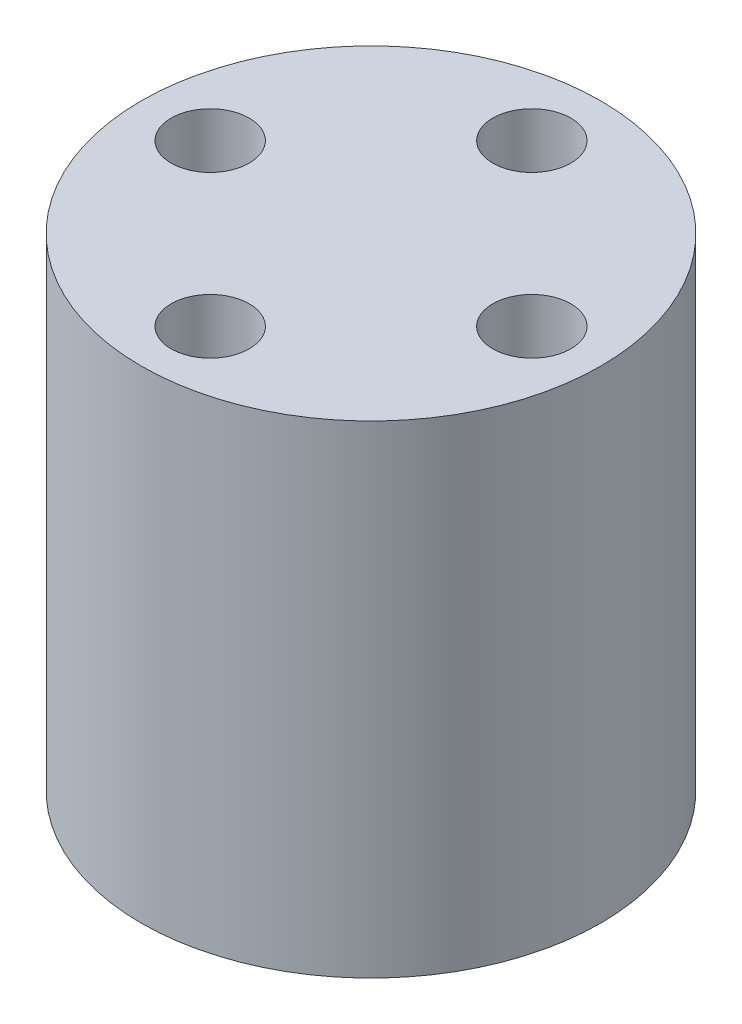
ISO-10303-21;
HEADER;
FILE_DESCRIPTION(('STEP AP214'),'2;1');
FILE_NAME('part.step','',(''),(''),'','','');
FILE_SCHEMA(('AUTOMOTIVE_DESIGN { 1 0 10303 214 1 1 1 1 }'));
ENDSEC;
DATA;
#1=APPLICATION_CONTEXT('core data for automotive mechanical design processes');
#2=APPLICATION_PROTOCOL_DEFINITION('international standard','automotive_design',2000,#1);
#3=PRODUCT_CONTEXT('',#1,'mechanical');
#4=PRODUCT('Part','Part','',(#3));
#5=PRODUCT_RELATED_PRODUCT_CATEGORY('part','',(#4));
#6=PRODUCT_DEFINITION_FORMATION('','',#4);
#7=PRODUCT_DEFINITION_CONTEXT('part definition',#1,'design');
#8=PRODUCT_DEFINITION('design','',#6,#7);
#9=PRODUCT_DEFINITION_SHAPE('','',#8);
#10=(LENGTH_UNIT() NAMED_UNIT(*) SI_UNIT(.MILLI.,.METRE.));
#11=(NAMED_UNIT(*) PLANE_ANGLE_UNIT() SI_UNIT($,.RADIAN.));
#12=(NAMED_UNIT(*) SI_UNIT($,.STERADIAN.) SOLID_ANGLE_UNIT());
#13=UNCERTAINTY_MEASURE_WITH_UNIT(LENGTH_MEASURE(1.E-05),#10,'distance_accuracy_value','');
#14=(GEOMETRIC_REPRESENTATION_CONTEXT(3) GLOBAL_UNCERTAINTY_ASSIGNED_CONTEXT((#13)) GLOBAL_UNIT_ASSIGNED_CONTEXT((#10,
#11,#12)) REPRESENTATION_CONTEXT('',''));
#15=CARTESIAN_POINT('',(0.,0.,0.));
#16=DIRECTION('',(0.,0.,1.));
#17=DIRECTION('',(1.,0.,0.));
#18=AXIS2_PLACEMENT_3D('',#15,#16,#17);
#19=CARTESIAN_POINT('',(0.,21.,0.));
#20=DIRECTION('',(0.,1.,0.));
#21=DIRECTION('',(0.,0.,1.));
#22=AXIS2_PLACEMENT_3D('',#19,#20,#21);
#23=PLANE('',#22);
#24=CARTESIAN_POINT('',(0.,21.,7.));
#25=DIRECTION('',(0.,1.,0.));
#26=DIRECTION('',(0.,0.,1.));
#27=AXIS2_PLACEMENT_3D('',#24,#25,#26);
#28=CIRCLE('',#27,1.7);
#29=CARTESIAN_POINT('',(0.,21.,5.3));
#30=VERTEX_POINT('',#29);
#31=EDGE_CURVE('E70',#30,#30,#28,.T.);
#32=ORIENTED_EDGE('',*,*,#31,.F.);
#33=EDGE_LOOP('',(#32));
#34=FACE_BOUND('',#33,.T.);
#35=CARTESIAN_POINT('',(0.,21.,-7.));
#36=DIRECTION('',(0.,1.,0.));
#37=DIRECTION('',(0.,0.,1.));
#38=AXIS2_PLACEMENT_3D('',#35,#36,#37);
#39=CIRCLE('',#38,1.7);
#40=CARTESIAN_POINT('',(0.,21.,-8.7));
#41=VERTEX_POINT('',#40);
#42=EDGE_CURVE('E56',#41,#41,#39,.T.);
#43=ORIENTED_EDGE('',*,*,#42,.F.);
#44=EDGE_LOOP('',(#43));
#45=FACE_BOUND('',#44,.T.);
#46=CARTESIAN_POINT('',(0.,21.,0.));
#47=DIRECTION('',(0.,1.,0.));
#48=DIRECTION('',(0.,0.,1.));
#49=AXIS2_PLACEMENT_3D('',#46,#47,#48);
#50=CIRCLE('',#49,10.);
#51=CARTESIAN_POINT('',(0.,21.,-10.));
#52=VERTEX_POINT('',#51);
#53=EDGE_CURVE('E10',#52,#52,#50,.T.);
#54=ORIENTED_EDGE('',*,*,#53,.T.);
#55=EDGE_LOOP('',(#54));
#56=FACE_BOUND('',#55,.T.);
#57=CARTESIAN_POINT('',(7.,21.,0.));
#58=DIRECTION('',(0.,1.,0.));
#59=DIRECTION('',(0.,0.,1.));
#60=AXIS2_PLACEMENT_3D('',#57,#58,#59);
#61=CIRCLE('',#60,1.7);
#62=CARTESIAN_POINT('',(7.,21.,-1.69999999999997));
#63=VERTEX_POINT('',#62);
#64=EDGE_CURVE('E62',#63,#63,#61,.T.);
#65=ORIENTED_EDGE('',*,*,#64,.F.);
#66=EDGE_LOOP('',(#65));
#67=FACE_BOUND('',#66,.T.);
#68=CARTESIAN_POINT('',(-7.,21.,0.));
#69=DIRECTION('',(0.,1.,0.));
#70=DIRECTION('',(0.,0.,1.));
#71=AXIS2_PLACEMENT_3D('',#68,#69,#70);
#72=CIRCLE('',#71,1.7);
#73=CARTESIAN_POINT('',(-7.,21.,-1.70000000000007));
#74=VERTEX_POINT('',#73);
#75=EDGE_CURVE('E78',#74,#74,#72,.T.);
#76=ORIENTED_EDGE('',*,*,#75,.F.);
#77=EDGE_LOOP('',(#76));
#78=FACE_BOUND('',#77,.T.);
#79=ADVANCED_FACE('F43',(#34,#45,#56,#67,#78),#23,.T.);
#80=CARTESIAN_POINT('',(0.,0.,0.));
#81=DIRECTION('',(0.,1.,0.));
#82=DIRECTION('',(0.,0.,1.));
#83=AXIS2_PLACEMENT_3D('',#80,#81,#82);
#84=PLANE('',#83);
#85=CARTESIAN_POINT('',(0.,0.,0.));
#86=DIRECTION('',(0.,1.,0.));
#87=DIRECTION('',(0.,0.,1.));
#88=AXIS2_PLACEMENT_3D('',#85,#86,#87);
#89=CIRCLE('',#88,10.);
#90=CARTESIAN_POINT('',(0.,0.,-10.));
#91=VERTEX_POINT('',#90);
#92=EDGE_CURVE('E47',#91,#91,#89,.T.);
#93=ORIENTED_EDGE('',*,*,#92,.F.);
#94=EDGE_LOOP('',(#93));
#95=FACE_BOUND('',#94,.T.);
#96=CARTESIAN_POINT('',(0.,0.,-7.));
#97=DIRECTION('',(0.,1.,0.));
#98=DIRECTION('',(0.,0.,1.));
#99=AXIS2_PLACEMENT_3D('',#96,#97,#98);
#100=CIRCLE('',#99,1.7);
#101=CARTESIAN_POINT('',(0.,0.,-8.7));
#102=VERTEX_POINT('',#101);
#103=EDGE_CURVE('E58',#102,#102,#100,.T.);
#104=ORIENTED_EDGE('',*,*,#103,.T.);
#105=EDGE_LOOP('',(#104));
#106=FACE_BOUND('',#105,.T.);
#107=CARTESIAN_POINT('',(7.,0.,0.));
#108=DIRECTION('',(0.,1.,0.));
#109=DIRECTION('',(0.,0.,1.));
#110=AXIS2_PLACEMENT_3D('',#107,#108,#109);
#111=CIRCLE('',#110,1.7);
#112=CARTESIAN_POINT('',(7.,0.,-1.69999999999997));
#113=VERTEX_POINT('',#112);
#114=EDGE_CURVE('E66',#113,#113,#111,.T.);
#115=ORIENTED_EDGE('',*,*,#114,.T.);
#116=EDGE_LOOP('',(#115));
#117=FACE_BOUND('',#116,.T.);
#118=CARTESIAN_POINT('',(0.,0.,7.));
#119=DIRECTION('',(0.,1.,0.));
#120=DIRECTION('',(0.,0.,1.));
#121=AXIS2_PLACEMENT_3D('',#118,#119,#120);
#122=CIRCLE('',#121,1.7);
#123=CARTESIAN_POINT('',(0.,0.,5.3));
#124=VERTEX_POINT('',#123);
#125=EDGE_CURVE('E74',#124,#124,#122,.T.);
#126=ORIENTED_EDGE('',*,*,#125,.T.);
#127=EDGE_LOOP('',(#126));
#128=FACE_BOUND('',#127,.T.);
#129=CARTESIAN_POINT('',(-7.,0.,0.));
#130=DIRECTION('',(0.,1.,0.));
#131=DIRECTION('',(0.,0.,1.));
#132=AXIS2_PLACEMENT_3D('',#129,#130,#131);
#133=CIRCLE('',#132,1.7);
#134=CARTESIAN_POINT('',(-7.,0.,-1.70000000000007));
#135=VERTEX_POINT('',#134);
#136=EDGE_CURVE('E82',#135,#135,#133,.T.);
#137=ORIENTED_EDGE('',*,*,#136,.T.);
#138=EDGE_LOOP('',(#137));
#139=FACE_BOUND('',#138,.T.);
#140=ADVANCED_FACE('F94',(#95,#106,#117,#128,#139),#84,.F.);
#141=CARTESIAN_POINT('',(0.,21.,0.));
#142=DIRECTION('',(0.,-1.,0.));
#143=DIRECTION('',(0.,0.,-1.));
#144=AXIS2_PLACEMENT_3D('',#141,#142,#143);
#145=CYLINDRICAL_SURFACE('',#144,10.);
#146=CARTESIAN_POINT('',(0.,21.,-10.));
#147=CARTESIAN_POINT('',(0.,20.78125,-10.));
#148=CARTESIAN_POINT('',(0.,20.5625,-10.));
#149=CARTESIAN_POINT('',(0.,20.125,-10.));
#150=CARTESIAN_POINT('',(0.,19.90625,-10.));
#151=CARTESIAN_POINT('',(0.,19.46875,-10.));
#152=CARTESIAN_POINT('',(0.,19.25,-10.));
#153=CARTESIAN_POINT('',(0.,18.8125,-10.));
#154=CARTESIAN_POINT('',(0.,18.59375,-10.));
#155=CARTESIAN_POINT('',(0.,18.15625,-10.));
#156=CARTESIAN_POINT('',(0.,17.9375,-10.));
#157=CARTESIAN_POINT('',(0.,17.5,-10.));
#158=CARTESIAN_POINT('',(0.,17.28125,-10.));
#159=CARTESIAN_POINT('',(0.,16.84375,-10.));
#160=CARTESIAN_POINT('',(0.,16.625,-10.));
#161=CARTESIAN_POINT('',(0.,16.1875,-10.));
#162=CARTESIAN_POINT('',(0.,15.96875,-10.));
#163=CARTESIAN_POINT('',(0.,15.53125,-10.));
#164=CARTESIAN_POINT('',(0.,15.3125,-10.));
#165=CARTESIAN_POINT('',(0.,14.875,-10.));
#166=CARTESIAN_POINT('',(0.,14.65625,-10.));
#167=CARTESIAN_POINT('',(0.,14.21875,-10.));
#168=CARTESIAN_POINT('',(0.,14.,-10.));
#169=CARTESIAN_POINT('',(0.,13.5625,-10.));
#170=CARTESIAN_POINT('',(0.,13.34375,-10.));
#171=CARTESIAN_POINT('',(0.,12.90625,-10.));
#172=CARTESIAN_POINT('',(0.,12.6875,-10.));
#173=CARTESIAN_POINT('',(0.,12.25,-10.));
#174=CARTESIAN_POINT('',(0.,12.03125,-10.));
#175=CARTESIAN_POINT('',(0.,11.59375,-10.));
#176=CARTESIAN_POINT('',(0.,11.375,-10.));
#177=CARTESIAN_POINT('',(0.,10.9375,-10.));
#178=CARTESIAN_POINT('',(0.,10.71875,-10.));
#179=CARTESIAN_POINT('',(0.,10.28125,-10.));
#180=CARTESIAN_POINT('',(0.,10.0625,-10.));
#181=CARTESIAN_POINT('',(0.,9.625,-10.));
#182=CARTESIAN_POINT('',(0.,9.40625,-10.));
#183=CARTESIAN_POINT('',(0.,8.96875,-10.));
#184=CARTESIAN_POINT('',(0.,8.75,-10.));
#185=CARTESIAN_POINT('',(0.,8.3125,-10.));
#186=CARTESIAN_POINT('',(0.,8.09375,-10.));
#187=CARTESIAN_POINT('',(0.,7.65625,-10.));
#188=CARTESIAN_POINT('',(0.,7.4375,-10.));
#189=CARTESIAN_POINT('',(0.,7.,-10.));
#190=CARTESIAN_POINT('',(0.,6.78125,-10.));
#191=CARTESIAN_POINT('',(0.,6.34375,-10.));
#192=CARTESIAN_POINT('',(0.,6.125,-10.));
#193=CARTESIAN_POINT('',(0.,5.6875,-10.));
#194=CARTESIAN_POINT('',(0.,5.46875,-10.));
#195=CARTESIAN_POINT('',(0.,5.03125,-10.));
#196=CARTESIAN_POINT('',(0.,4.8125,-10.));
#197=CARTESIAN_POINT('',(0.,4.375,-10.));
#198=CARTESIAN_POINT('',(0.,4.15625,-10.));
#199=CARTESIAN_POINT('',(0.,3.71875,-10.));
#200=CARTESIAN_POINT('',(0.,3.5,-10.));
#201=CARTESIAN_POINT('',(0.,3.0625,-10.));
#202=CARTESIAN_POINT('',(0.,2.84375,-10.));
#203=CARTESIAN_POINT('',(0.,2.40625,-10.));
#204=CARTESIAN_POINT('',(0.,2.1875,-10.));
#205=CARTESIAN_POINT('',(0.,1.75,-10.));
#206=CARTESIAN_POINT('',(0.,1.53125,-10.));
#207=CARTESIAN_POINT('',(0.,1.09375,-10.));
#208=CARTESIAN_POINT('',(0.,0.875000000000001,-10.));
#209=CARTESIAN_POINT('',(0.,0.4375,-10.));
#210=CARTESIAN_POINT('',(0.,0.21875,-10.));
#211=CARTESIAN_POINT('',(0.,0.,-10.));
#212=B_SPLINE_CURVE_WITH_KNOTS('',3,(#146,#147,#148,#149,#150,#151,#152,#153,#154,#155,#156,
#157,#158,#159,#160,#161,#162,#163,#164,#165,#166,#167,#168,#169,#170,#171,#172,#173,#174,#175,
#176,#177,#178,#179,#180,#181,#182,#183,#184,#185,#186,#187,#188,#189,#190,#191,#192,#193,#194,
#195,#196,#197,#198,#199,#200,#201,#202,#203,#204,#205,#206,#207,#208,#209,#210,#211),
.UNSPECIFIED.,.F.,.F.,(4,2,2,2,2,2,2,2,2,2,2,2,2,2,2,2,2,2,2,2,2,2,2,2,2,2,2,2,2,2,2,2,4),(0.,
0.656249999999997,1.3125,1.96875,2.625,3.28125,3.9375,4.59375,5.25,5.90625,6.5625,7.21875,7.875,
8.53125,9.1875,9.84375,10.5,11.15625,11.8125,12.46875,13.125,13.78125,14.4375,15.09375,15.75,
16.40625,17.0625,17.71875,18.375,19.03125,19.6875,20.34375,21.),.UNSPECIFIED.);
#213=EDGE_CURVE('BSEAM45',#52,#91,#212,.T.);
#214=ORIENTED_EDGE('',*,*,#53,.F.);
#215=ORIENTED_EDGE('',*,*,#92,.T.);
#216=ORIENTED_EDGE('',*,*,#213,.T.);
#217=ORIENTED_EDGE('',*,*,#213,.F.);
#218=EDGE_LOOP('',(#214,#216,#215,#217));
#219=FACE_BOUND('',#218,.T.);
#220=ADVANCED_FACE('F45',(#219),#145,.T.);
#221=CARTESIAN_POINT('',(0.,21.,-7.));
#222=DIRECTION('',(0.,-1.,0.));
#223=DIRECTION('',(0.,0.,-1.));
#224=AXIS2_PLACEMENT_3D('',#221,#222,#223);
#225=CYLINDRICAL_SURFACE('',#224,1.7);
#226=CARTESIAN_POINT('',(0.,21.,-8.7));
#227=CARTESIAN_POINT('',(0.,20.78125,-8.7));
#228=CARTESIAN_POINT('',(0.,20.5625,-8.7));
#229=CARTESIAN_POINT('',(0.,20.125,-8.7));
#230=CARTESIAN_POINT('',(0.,19.90625,-8.7));
#231=CARTESIAN_POINT('',(0.,19.46875,-8.7));
#232=CARTESIAN_POINT('',(0.,19.25,-8.7));
#233=CARTESIAN_POINT('',(0.,18.8125,-8.7));
#234=CARTESIAN_POINT('',(0.,18.59375,-8.7));
#235=CARTESIAN_POINT('',(0.,18.15625,-8.7));
#236=CARTESIAN_POINT('',(0.,17.9375,-8.7));
#237=CARTESIAN_POINT('',(0.,17.5,-8.7));
#238=CARTESIAN_POINT('',(0.,17.28125,-8.7));
#239=CARTESIAN_POINT('',(0.,16.84375,-8.7));
#240=CARTESIAN_POINT('',(0.,16.625,-8.7));
#241=CARTESIAN_POINT('',(0.,16.1875,-8.7));
#242=CARTESIAN_POINT('',(0.,15.96875,-8.7));
#243=CARTESIAN_POINT('',(0.,15.53125,-8.7));
#244=CARTESIAN_POINT('',(0.,15.3125,-8.7));
#245=CARTESIAN_POINT('',(0.,14.875,-8.7));
#246=CARTESIAN_POINT('',(0.,14.65625,-8.7));
#247=CARTESIAN_POINT('',(0.,14.21875,-8.7));
#248=CARTESIAN_POINT('',(0.,14.,-8.7));
#249=CARTESIAN_POINT('',(0.,13.5625,-8.7));
#250=CARTESIAN_POINT('',(0.,13.34375,-8.7));
#251=CARTESIAN_POINT('',(0.,12.90625,-8.7));
#252=CARTESIAN_POINT('',(0.,12.6875,-8.7));
#253=CARTESIAN_POINT('',(0.,12.25,-8.7));
#254=CARTESIAN_POINT('',(0.,12.03125,-8.7));
#255=CARTESIAN_POINT('',(0.,11.59375,-8.7));
#256=CARTESIAN_POINT('',(0.,11.375,-8.7));
#257=CARTESIAN_POINT('',(0.,10.9375,-8.7));
#258=CARTESIAN_POINT('',(0.,10.71875,-8.7));
#259=CARTESIAN_POINT('',(0.,10.28125,-8.7));
#260=CARTESIAN_POINT('',(0.,10.0625,-8.7));
#261=CARTESIAN_POINT('',(0.,9.625,-8.7));
#262=CARTESIAN_POINT('',(0.,9.40625,-8.7));
#263=CARTESIAN_POINT('',(0.,8.96875,-8.7));
#264=CARTESIAN_POINT('',(0.,8.75,-8.7));
#265=CARTESIAN_POINT('',(0.,8.3125,-8.7));
#266=CARTESIAN_POINT('',(0.,8.09375,-8.7));
#267=CARTESIAN_POINT('',(0.,7.65625,-8.7));
#268=CARTESIAN_POINT('',(0.,7.4375,-8.7));
#269=CARTESIAN_POINT('',(0.,7.,-8.7));
#270=CARTESIAN_POINT('',(0.,6.78125,-8.7));
#271=CARTESIAN_POINT('',(0.,6.34375,-8.7));
#272=CARTESIAN_POINT('',(0.,6.125,-8.7));
#273=CARTESIAN_POINT('',(0.,5.6875,-8.7));
#274=CARTESIAN_POINT('',(0.,5.46875,-8.7));
#275=CARTESIAN_POINT('',(0.,5.03125,-8.7));
#276=CARTESIAN_POINT('',(0.,4.8125,-8.7));
#277=CARTESIAN_POINT('',(0.,4.375,-8.7));
#278=CARTESIAN_POINT('',(0.,4.15625,-8.7));
#279=CARTESIAN_POINT('',(0.,3.71875,-8.7));
#280=CARTESIAN_POINT('',(0.,3.5,-8.7));
#281=CARTESIAN_POINT('',(0.,3.0625,-8.7));
#282=CARTESIAN_POINT('',(0.,2.84375,-8.7));
#283=CARTESIAN_POINT('',(0.,2.40625,-8.7));
#284=CARTESIAN_POINT('',(0.,2.1875,-8.7));
#285=CARTESIAN_POINT('',(0.,1.75,-8.7));
#286=CARTESIAN_POINT('',(0.,1.53125,-8.7));
#287=CARTESIAN_POINT('',(0.,1.09375,-8.7));
#288=CARTESIAN_POINT('',(0.,0.875000000000001,-8.7));
#289=CARTESIAN_POINT('',(0.,0.4375,-8.7));
#290=CARTESIAN_POINT('',(0.,0.21875,-8.7));
#291=CARTESIAN_POINT('',(0.,0.,-8.7));
#292=B_SPLINE_CURVE_WITH_KNOTS('',3,(#226,#227,#228,#229,#230,#231,#232,#233,#234,#235,#236,
#237,#238,#239,#240,#241,#242,#243,#244,#245,#246,#247,#248,#249,#250,#251,#252,#253,#254,#255,
#256,#257,#258,#259,#260,#261,#262,#263,#264,#265,#266,#267,#268,#269,#270,#271,#272,#273,#274,
#275,#276,#277,#278,#279,#280,#281,#282,#283,#284,#285,#286,#287,#288,#289,#290,#291),
.UNSPECIFIED.,.F.,.F.,(4,2,2,2,2,2,2,2,2,2,2,2,2,2,2,2,2,2,2,2,2,2,2,2,2,2,2,2,2,2,2,2,4),(0.,
0.656249999999997,1.3125,1.96875,2.625,3.28125,3.9375,4.59375,5.25,5.90625,6.5625,7.21875,7.875,
8.53125,9.1875,9.84375,10.5,11.15625,11.8125,12.46875,13.125,13.78125,14.4375,15.09375,15.75,
16.40625,17.0625,17.71875,18.375,19.03125,19.6875,20.34375,21.),.UNSPECIFIED.);
#293=EDGE_CURVE('BSEAM104',#41,#102,#292,.T.);
#294=ORIENTED_EDGE('',*,*,#42,.T.);
#295=ORIENTED_EDGE('',*,*,#103,.F.);
#296=ORIENTED_EDGE('',*,*,#293,.T.);
#297=ORIENTED_EDGE('',*,*,#293,.F.);
#298=EDGE_LOOP('',(#294,#296,#295,#297));
#299=FACE_BOUND('',#298,.T.);
#300=ADVANCED_FACE('F104',(#299),#225,.F.);
#301=CARTESIAN_POINT('',(7.,21.,0.));
#302=DIRECTION('',(0.,-1.,0.));
#303=DIRECTION('',(0.,0.,-1.));
#304=AXIS2_PLACEMENT_3D('',#301,#302,#303);
#305=CYLINDRICAL_SURFACE('',#304,1.7);
#306=CARTESIAN_POINT('',(7.,21.,-1.69999999999997));
#307=CARTESIAN_POINT('',(7.,20.78125,-1.69999999999997));
#308=CARTESIAN_POINT('',(7.,20.5625,-1.69999999999997));
#309=CARTESIAN_POINT('',(7.,20.125,-1.69999999999997));
#310=CARTESIAN_POINT('',(7.,19.90625,-1.69999999999997));
#311=CARTESIAN_POINT('',(7.,19.46875,-1.69999999999997));
#312=CARTESIAN_POINT('',(7.,19.25,-1.69999999999997));
#313=CARTESIAN_POINT('',(7.,18.8125,-1.69999999999997));
#314=CARTESIAN_POINT('',(7.,18.59375,-1.69999999999997));
#315=CARTESIAN_POINT('',(7.,18.15625,-1.69999999999997));
#316=CARTESIAN_POINT('',(7.,17.9375,-1.69999999999997));
#317=CARTESIAN_POINT('',(7.,17.5,-1.69999999999997));
#318=CARTESIAN_POINT('',(7.,17.28125,-1.69999999999997));
#319=CARTESIAN_POINT('',(7.,16.84375,-1.69999999999997));
#320=CARTESIAN_POINT('',(7.,16.625,-1.69999999999997));
#321=CARTESIAN_POINT('',(7.,16.1875,-1.69999999999997));
#322=CARTESIAN_POINT('',(7.,15.96875,-1.69999999999997));
#323=CARTESIAN_POINT('',(7.,15.53125,-1.69999999999997));
#324=CARTESIAN_POINT('',(7.,15.3125,-1.69999999999997));
#325=CARTESIAN_POINT('',(7.,14.875,-1.69999999999997));
#326=CARTESIAN_POINT('',(7.,14.65625,-1.69999999999997));
#327=CARTESIAN_POINT('',(7.,14.21875,-1.69999999999997));
#328=CARTESIAN_POINT('',(7.,14.,-1.69999999999997));
#329=CARTESIAN_POINT('',(7.,13.5625,-1.69999999999997));
#330=CARTESIAN_POINT('',(7.,13.34375,-1.69999999999997));
#331=CARTESIAN_POINT('',(7.,12.90625,-1.69999999999997));
#332=CARTESIAN_POINT('',(7.,12.6875,-1.69999999999997));
#333=CARTESIAN_POINT('',(7.,12.25,-1.69999999999997));
#334=CARTESIAN_POINT('',(7.,12.03125,-1.69999999999997));
#335=CARTESIAN_POINT('',(7.,11.59375,-1.69999999999997));
#336=CARTESIAN_POINT('',(7.,11.375,-1.69999999999997));
#337=CARTESIAN_POINT('',(7.,10.9375,-1.69999999999997));
#338=CARTESIAN_POINT('',(7.,10.71875,-1.69999999999997));
#339=CARTESIAN_POINT('',(7.,10.28125,-1.69999999999997));
#340=CARTESIAN_POINT('',(7.,10.0625,-1.69999999999997));
#341=CARTESIAN_POINT('',(7.,9.625,-1.69999999999997));
#342=CARTESIAN_POINT('',(7.,9.40625,-1.69999999999997));
#343=CARTESIAN_POINT('',(7.,8.96875,-1.69999999999997));
#344=CARTESIAN_POINT('',(7.,8.75,-1.69999999999997));
#345=CARTESIAN_POINT('',(7.,8.3125,-1.69999999999997));
#346=CARTESIAN_POINT('',(7.,8.09375,-1.69999999999997));
#347=CARTESIAN_POINT('',(7.,7.65625,-1.69999999999997));
#348=CARTESIAN_POINT('',(7.,7.4375,-1.69999999999997));
#349=CARTESIAN_POINT('',(7.,7.,-1.69999999999997));
#350=CARTESIAN_POINT('',(7.,6.78125,-1.69999999999997));
#351=CARTESIAN_POINT('',(7.,6.34375,-1.69999999999997));
#352=CARTESIAN_POINT('',(7.,6.125,-1.69999999999997));
#353=CARTESIAN_POINT('',(7.,5.6875,-1.69999999999997));
#354=CARTESIAN_POINT('',(7.,5.46875,-1.69999999999997));
#355=CARTESIAN_POINT('',(7.,5.03125,-1.69999999999997));
#356=CARTESIAN_POINT('',(7.,4.8125,-1.69999999999997));
#357=CARTESIAN_POINT('',(7.,4.375,-1.69999999999997));
#358=CARTESIAN_POINT('',(7.,4.15625,-1.69999999999997));
#359=CARTESIAN_POINT('',(7.,3.71875,-1.69999999999997));
#360=CARTESIAN_POINT('',(7.,3.5,-1.69999999999997));
#361=CARTESIAN_POINT('',(7.,3.0625,-1.69999999999997));
#362=CARTESIAN_POINT('',(7.,2.84375,-1.69999999999997));
#363=CARTESIAN_POINT('',(7.,2.40625,-1.69999999999997));
#364=CARTESIAN_POINT('',(7.,2.1875,-1.69999999999997));
#365=CARTESIAN_POINT('',(7.,1.75,-1.69999999999997));
#366=CARTESIAN_POINT('',(7.,1.53125,-1.69999999999997));
#367=CARTESIAN_POINT('',(7.,1.09375,-1.69999999999997));
#368=CARTESIAN_POINT('',(7.,0.875000000000001,-1.69999999999997));
#369=CARTESIAN_POINT('',(7.,0.4375,-1.69999999999997));
#370=CARTESIAN_POINT('',(7.,0.21875,-1.69999999999997));
#371=CARTESIAN_POINT('',(7.,0.,-1.69999999999997));
#372=B_SPLINE_CURVE_WITH_KNOTS('',3,(#306,#307,#308,#309,#310,#311,#312,#313,#314,#315,#316,
#317,#318,#319,#320,#321,#322,#323,#324,#325,#326,#327,#328,#329,#330,#331,#332,#333,#334,#335,
#336,#337,#338,#339,#340,#341,#342,#343,#344,#345,#346,#347,#348,#349,#350,#351,#352,#353,#354,
#355,#356,#357,#358,#359,#360,#361,#362,#363,#364,#365,#366,#367,#368,#369,#370,#371),
.UNSPECIFIED.,.F.,.F.,(4,2,2,2,2,2,2,2,2,2,2,2,2,2,2,2,2,2,2,2,2,2,2,2,2,2,2,2,2,2,2,2,4),(0.,
0.656249999999997,1.3125,1.96875,2.625,3.28125,3.9375,4.59375,5.25,5.90625,6.5625,7.21875,7.875,
8.53125,9.1875,9.84375,10.5,11.15625,11.8125,12.46875,13.125,13.78125,14.4375,15.09375,15.75,
16.40625,17.0625,17.71875,18.375,19.03125,19.6875,20.34375,21.),.UNSPECIFIED.);
#373=EDGE_CURVE('BSEAM107',#63,#113,#372,.T.);
#374=ORIENTED_EDGE('',*,*,#64,.T.);
#375=ORIENTED_EDGE('',*,*,#114,.F.);
#376=ORIENTED_EDGE('',*,*,#373,.T.);
#377=ORIENTED_EDGE('',*,*,#373,.F.);
#378=EDGE_LOOP('',(#374,#376,#375,#377));
#379=FACE_BOUND('',#378,.T.);
#380=ADVANCED_FACE('F107',(#379),#305,.F.);
#381=CARTESIAN_POINT('',(0.,21.,7.));
#382=DIRECTION('',(0.,-1.,0.));
#383=DIRECTION('',(0.,0.,-1.));
#384=AXIS2_PLACEMENT_3D('',#381,#382,#383);
#385=CYLINDRICAL_SURFACE('',#384,1.7);
#386=CARTESIAN_POINT('',(0.,21.,5.3));
#387=CARTESIAN_POINT('',(0.,20.78125,5.3));
#388=CARTESIAN_POINT('',(0.,20.5625,5.3));
#389=CARTESIAN_POINT('',(0.,20.125,5.3));
#390=CARTESIAN_POINT('',(0.,19.90625,5.3));
#391=CARTESIAN_POINT('',(0.,19.46875,5.3));
#392=CARTESIAN_POINT('',(0.,19.25,5.3));
#393=CARTESIAN_POINT('',(0.,18.8125,5.3));
#394=CARTESIAN_POINT('',(0.,18.59375,5.3));
#395=CARTESIAN_POINT('',(0.,18.15625,5.3));
#396=CARTESIAN_POINT('',(0.,17.9375,5.3));
#397=CARTESIAN_POINT('',(0.,17.5,5.3));
#398=CARTESIAN_POINT('',(0.,17.28125,5.3));
#399=CARTESIAN_POINT('',(0.,16.84375,5.3));
#400=CARTESIAN_POINT('',(0.,16.625,5.3));
#401=CARTESIAN_POINT('',(0.,16.1875,5.3));
#402=CARTESIAN_POINT('',(0.,15.96875,5.3));
#403=CARTESIAN_POINT('',(0.,15.53125,5.3));
#404=CARTESIAN_POINT('',(0.,15.3125,5.3));
#405=CARTESIAN_POINT('',(0.,14.875,5.3));
#406=CARTESIAN_POINT('',(0.,14.65625,5.3));
#407=CARTESIAN_POINT('',(0.,14.21875,5.3));
#408=CARTESIAN_POINT('',(0.,14.,5.3));
#409=CARTESIAN_POINT('',(0.,13.5625,5.3));
#410=CARTESIAN_POINT('',(0.,13.34375,5.3));
#411=CARTESIAN_POINT('',(0.,12.90625,5.3));
#412=CARTESIAN_POINT('',(0.,12.6875,5.3));
#413=CARTESIAN_POINT('',(0.,12.25,5.3));
#414=CARTESIAN_POINT('',(0.,12.03125,5.3));
#415=CARTESIAN_POINT('',(0.,11.59375,5.3));
#416=CARTESIAN_POINT('',(0.,11.375,5.3));
#417=CARTESIAN_POINT('',(0.,10.9375,5.3));
#418=CARTESIAN_POINT('',(0.,10.71875,5.3));
#419=CARTESIAN_POINT('',(0.,10.28125,5.3));
#420=CARTESIAN_POINT('',(0.,10.0625,5.3));
#421=CARTESIAN_POINT('',(0.,9.625,5.3));
#422=CARTESIAN_POINT('',(0.,9.40625,5.3));
#423=CARTESIAN_POINT('',(0.,8.96875,5.3));
#424=CARTESIAN_POINT('',(0.,8.75,5.3));
#425=CARTESIAN_POINT('',(0.,8.3125,5.3));
#426=CARTESIAN_POINT('',(0.,8.09375,5.3));
#427=CARTESIAN_POINT('',(0.,7.65625,5.3));
#428=CARTESIAN_POINT('',(0.,7.4375,5.3));
#429=CARTESIAN_POINT('',(0.,7.,5.3));
#430=CARTESIAN_POINT('',(0.,6.78125,5.3));
#431=CARTESIAN_POINT('',(0.,6.34375,5.3));
#432=CARTESIAN_POINT('',(0.,6.125,5.3));
#433=CARTESIAN_POINT('',(0.,5.6875,5.3));
#434=CARTESIAN_POINT('',(0.,5.46875,5.3));
#435=CARTESIAN_POINT('',(0.,5.03125,5.3));
#436=CARTESIAN_POINT('',(0.,4.8125,5.3));
#437=CARTESIAN_POINT('',(0.,4.375,5.3));
#438=CARTESIAN_POINT('',(0.,4.15625,5.3));
#439=CARTESIAN_POINT('',(0.,3.71875,5.3));
#440=CARTESIAN_POINT('',(0.,3.5,5.3));
#441=CARTESIAN_POINT('',(0.,3.0625,5.3));
#442=CARTESIAN_POINT('',(0.,2.84375,5.3));
#443=CARTESIAN_POINT('',(0.,2.40625,5.3));
#444=CARTESIAN_POINT('',(0.,2.1875,5.3));
#445=CARTESIAN_POINT('',(0.,1.75,5.3));
#446=CARTESIAN_POINT('',(0.,1.53125,5.3));
#447=CARTESIAN_POINT('',(0.,1.09375,5.3));
#448=CARTESIAN_POINT('',(0.,0.875000000000001,5.3));
#449=CARTESIAN_POINT('',(0.,0.4375,5.3));
#450=CARTESIAN_POINT('',(0.,0.21875,5.3));
#451=CARTESIAN_POINT('',(0.,0.,5.3));
#452=B_SPLINE_CURVE_WITH_KNOTS('',3,(#386,#387,#388,#389,#390,#391,#392,#393,#394,#395,#396,
#397,#398,#399,#400,#401,#402,#403,#404,#405,#406,#407,#408,#409,#410,#411,#412,#413,#414,#415,
#416,#417,#418,#419,#420,#421,#422,#423,#424,#425,#426,#427,#428,#429,#430,#431,#432,#433,#434,
#435,#436,#437,#438,#439,#440,#441,#442,#443,#444,#445,#446,#447,#448,#449,#450,#451),
.UNSPECIFIED.,.F.,.F.,(4,2,2,2,2,2,2,2,2,2,2,2,2,2,2,2,2,2,2,2,2,2,2,2,2,2,2,2,2,2,2,2,4),(0.,
0.656249999999997,1.3125,1.96875,2.625,3.28125,3.9375,4.59375,5.25,5.90625,6.5625,7.21875,7.875,
8.53125,9.1875,9.84375,10.5,11.15625,11.8125,12.46875,13.125,13.78125,14.4375,15.09375,15.75,
16.40625,17.0625,17.71875,18.375,19.03125,19.6875,20.34375,21.),.UNSPECIFIED.);
#453=EDGE_CURVE('BSEAM111',#30,#124,#452,.T.);
#454=ORIENTED_EDGE('',*,*,#31,.T.);
#455=ORIENTED_EDGE('',*,*,#125,.F.);
#456=ORIENTED_EDGE('',*,*,#453,.T.);
#457=ORIENTED_EDGE('',*,*,#453,.F.);
#458=EDGE_LOOP('',(#454,#456,#455,#457));
#459=FACE_BOUND('',#458,.T.);
#460=ADVANCED_FACE('F111',(#459),#385,.F.);
#461=CARTESIAN_POINT('',(-7.,21.,0.));
#462=DIRECTION('',(0.,-1.,0.));
#463=DIRECTION('',(0.,0.,-1.));
#464=AXIS2_PLACEMENT_3D('',#461,#462,#463);
#465=CYLINDRICAL_SURFACE('',#464,1.7);
#466=CARTESIAN_POINT('',(-7.,21.,-1.70000000000007));
#467=CARTESIAN_POINT('',(-7.,20.78125,-1.70000000000007));
#468=CARTESIAN_POINT('',(-7.,20.5625,-1.70000000000007));
#469=CARTESIAN_POINT('',(-7.,20.125,-1.70000000000007));
#470=CARTESIAN_POINT('',(-7.,19.90625,-1.70000000000007));
#471=CARTESIAN_POINT('',(-7.,19.46875,-1.70000000000007));
#472=CARTESIAN_POINT('',(-7.,19.25,-1.70000000000007));
#473=CARTESIAN_POINT('',(-7.,18.8125,-1.70000000000007));
#474=CARTESIAN_POINT('',(-7.,18.59375,-1.70000000000007));
#475=CARTESIAN_POINT('',(-7.,18.15625,-1.70000000000007));
#476=CARTESIAN_POINT('',(-7.,17.9375,-1.70000000000007));
#477=CARTESIAN_POINT('',(-7.,17.5,-1.70000000000007));
#478=CARTESIAN_POINT('',(-7.,17.28125,-1.70000000000007));
#479=CARTESIAN_POINT('',(-7.,16.84375,-1.70000000000007));
#480=CARTESIAN_POINT('',(-7.,16.625,-1.70000000000007));
#481=CARTESIAN_POINT('',(-7.,16.1875,-1.70000000000007));
#482=CARTESIAN_POINT('',(-7.,15.96875,-1.70000000000007));
#483=CARTESIAN_POINT('',(-7.,15.53125,-1.70000000000007));
#484=CARTESIAN_POINT('',(-7.,15.3125,-1.70000000000007));
#485=CARTESIAN_POINT('',(-7.,14.875,-1.70000000000007));
#486=CARTESIAN_POINT('',(-7.,14.65625,-1.70000000000007));
#487=CARTESIAN_POINT('',(-7.,14.21875,-1.70000000000007));
#488=CARTESIAN_POINT('',(-7.,14.,-1.70000000000007));
#489=CARTESIAN_POINT('',(-7.,13.5625,-1.70000000000007));
#490=CARTESIAN_POINT('',(-7.,13.34375,-1.70000000000007));
#491=CARTESIAN_POINT('',(-7.,12.90625,-1.70000000000007));
#492=CARTESIAN_POINT('',(-7.,12.6875,-1.70000000000007));
#493=CARTESIAN_POINT('',(-7.,12.25,-1.70000000000007));
#494=CARTESIAN_POINT('',(-7.,12.03125,-1.70000000000007));
#495=CARTESIAN_POINT('',(-7.,11.59375,-1.70000000000007));
#496=CARTESIAN_POINT('',(-7.,11.375,-1.70000000000007));
#497=CARTESIAN_POINT('',(-7.,10.9375,-1.70000000000007));
#498=CARTESIAN_POINT('',(-7.,10.71875,-1.70000000000007));
#499=CARTESIAN_POINT('',(-7.,10.28125,-1.70000000000007));
#500=CARTESIAN_POINT('',(-7.,10.0625,-1.70000000000007));
#501=CARTESIAN_POINT('',(-7.,9.625,-1.70000000000007));
#502=CARTESIAN_POINT('',(-7.,9.40625,-1.70000000000007));
#503=CARTESIAN_POINT('',(-7.,8.96875,-1.70000000000007));
#504=CARTESIAN_POINT('',(-7.,8.75,-1.70000000000007));
#505=CARTESIAN_POINT('',(-7.,8.3125,-1.70000000000007));
#506=CARTESIAN_POINT('',(-7.,8.09375,-1.70000000000007));
#507=CARTESIAN_POINT('',(-7.,7.65625,-1.70000000000007));
#508=CARTESIAN_POINT('',(-7.,7.4375,-1.70000000000007));
#509=CARTESIAN_POINT('',(-7.,7.,-1.70000000000007));
#510=CARTESIAN_POINT('',(-7.,6.78125,-1.70000000000007));
#511=CARTESIAN_POINT('',(-7.,6.34375,-1.70000000000007));
#512=CARTESIAN_POINT('',(-7.,6.125,-1.70000000000007));
#513=CARTESIAN_POINT('',(-7.,5.6875,-1.70000000000007));
#514=CARTESIAN_POINT('',(-7.,5.46875,-1.70000000000007));
#515=CARTESIAN_POINT('',(-7.,5.03125,-1.70000000000007));
#516=CARTESIAN_POINT('',(-7.,4.8125,-1.70000000000007));
#517=CARTESIAN_POINT('',(-7.,4.375,-1.70000000000007));
#518=CARTESIAN_POINT('',(-7.,4.15625,-1.70000000000007));
#519=CARTESIAN_POINT('',(-7.,3.71875,-1.70000000000007));
#520=CARTESIAN_POINT('',(-7.,3.5,-1.70000000000007));
#521=CARTESIAN_POINT('',(-7.,3.0625,-1.70000000000007));
#522=CARTESIAN_POINT('',(-7.,2.84375,-1.70000000000007));
#523=CARTESIAN_POINT('',(-7.,2.40625,-1.70000000000007));
#524=CARTESIAN_POINT('',(-7.,2.1875,-1.70000000000007));
#525=CARTESIAN_POINT('',(-7.,1.75,-1.70000000000007));
#526=CARTESIAN_POINT('',(-7.,1.53125,-1.70000000000007));
#527=CARTESIAN_POINT('',(-7.,1.09375,-1.70000000000007));
#528=CARTESIAN_POINT('',(-7.,0.875000000000001,-1.70000000000007));
#529=CARTESIAN_POINT('',(-7.,0.4375,-1.70000000000007));
#530=CARTESIAN_POINT('',(-7.,0.21875,-1.70000000000007));
#531=CARTESIAN_POINT('',(-7.,0.,-1.70000000000007));
#532=B_SPLINE_CURVE_WITH_KNOTS('',3,(#466,#467,#468,#469,#470,#471,#472,#473,#474,#475,#476,
#477,#478,#479,#480,#481,#482,#483,#484,#485,#486,#487,#488,#489,#490,#491,#492,#493,#494,#495,
#496,#497,#498,#499,#500,#501,#502,#503,#504,#505,#506,#507,#508,#509,#510,#511,#512,#513,#514,
#515,#516,#517,#518,#519,#520,#521,#522,#523,#524,#525,#526,#527,#528,#529,#530,#531),
.UNSPECIFIED.,.F.,.F.,(4,2,2,2,2,2,2,2,2,2,2,2,2,2,2,2,2,2,2,2,2,2,2,2,2,2,2,2,2,2,2,2,4),(0.,
0.656249999999997,1.3125,1.96875,2.625,3.28125,3.9375,4.59375,5.25,5.90625,6.5625,7.21875,7.875,
8.53125,9.1875,9.84375,10.5,11.15625,11.8125,12.46875,13.125,13.78125,14.4375,15.09375,15.75,
16.40625,17.0625,17.71875,18.375,19.03125,19.6875,20.34375,21.),.UNSPECIFIED.);
#533=EDGE_CURVE('BSEAM90',#74,#135,#532,.T.);
#534=ORIENTED_EDGE('',*,*,#75,.T.);
#535=ORIENTED_EDGE('',*,*,#136,.F.);
#536=ORIENTED_EDGE('',*,*,#533,.T.);
#537=ORIENTED_EDGE('',*,*,#533,.F.);
#538=EDGE_LOOP('',(#534,#536,#535,#537));
#539=FACE_BOUND('',#538,.T.);
#540=ADVANCED_FACE('F90',(#539),#465,.F.);
#541=CLOSED_SHELL('',(#79,#140,#220,#300,#380,#460,#540));
#542=MANIFOLD_SOLID_BREP('B2',#541);
#543=ADVANCED_BREP_SHAPE_REPRESENTATION('',(#18,#542),#14);
#544=SHAPE_DEFINITION_REPRESENTATION(#9,#543);
ENDSEC;
END-ISO-10303-21;
